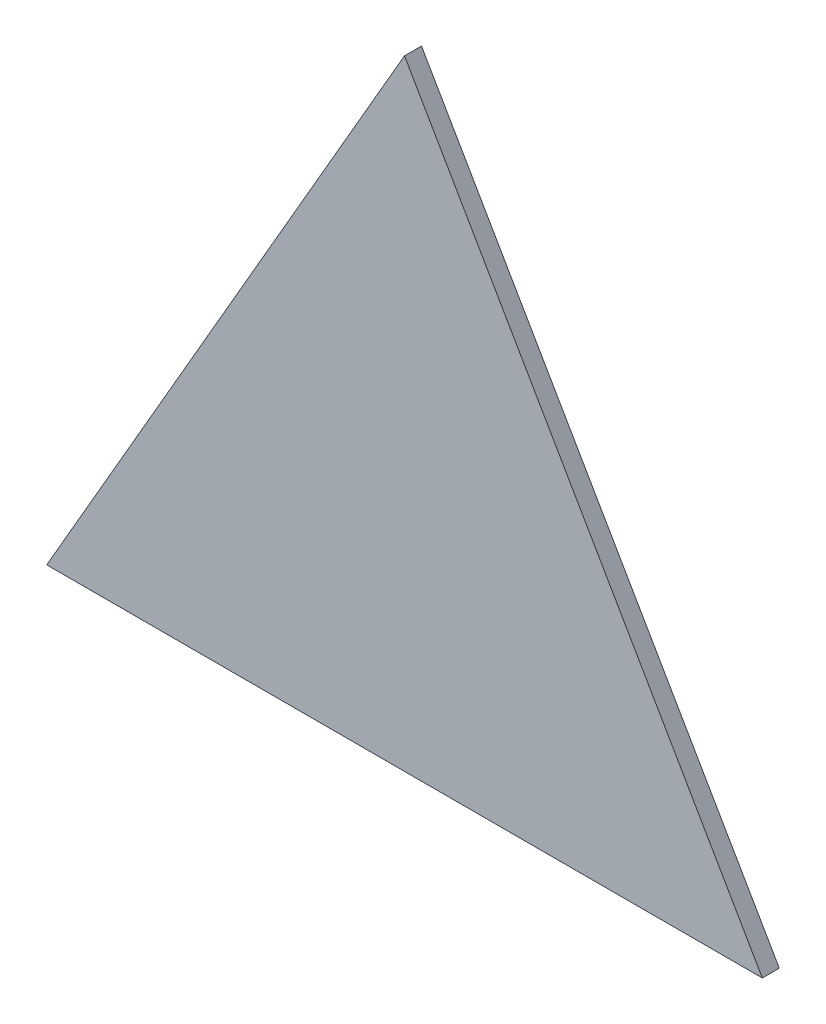
ISO-10303-21;
HEADER;
FILE_DESCRIPTION(('STEP AP214'),'2;1');
FILE_NAME('part.step','',(''),(''),'','','');
FILE_SCHEMA(('AUTOMOTIVE_DESIGN { 1 0 10303 214 1 1 1 1 }'));
ENDSEC;
DATA;
#1=APPLICATION_CONTEXT('core data for automotive mechanical design processes');
#2=APPLICATION_PROTOCOL_DEFINITION('international standard','automotive_design',2000,#1);
#3=PRODUCT_CONTEXT('',#1,'mechanical');
#4=PRODUCT('Part','Part','',(#3));
#5=PRODUCT_RELATED_PRODUCT_CATEGORY('part','',(#4));
#6=PRODUCT_DEFINITION_FORMATION('','',#4);
#7=PRODUCT_DEFINITION_CONTEXT('part definition',#1,'design');
#8=PRODUCT_DEFINITION('design','',#6,#7);
#9=PRODUCT_DEFINITION_SHAPE('','',#8);
#10=(LENGTH_UNIT() NAMED_UNIT(*) SI_UNIT(.MILLI.,.METRE.));
#11=(NAMED_UNIT(*) PLANE_ANGLE_UNIT() SI_UNIT($,.RADIAN.));
#12=(NAMED_UNIT(*) SI_UNIT($,.STERADIAN.) SOLID_ANGLE_UNIT());
#13=UNCERTAINTY_MEASURE_WITH_UNIT(LENGTH_MEASURE(1.E-05),#10,'distance_accuracy_value','');
#14=(GEOMETRIC_REPRESENTATION_CONTEXT(3) GLOBAL_UNCERTAINTY_ASSIGNED_CONTEXT((#13)) GLOBAL_UNIT_ASSIGNED_CONTEXT((#10,
#11,#12)) REPRESENTATION_CONTEXT('',''));
#15=CARTESIAN_POINT('',(0.,0.,0.));
#16=DIRECTION('',(0.,0.,1.));
#17=DIRECTION('',(1.,0.,0.));
#18=AXIS2_PLACEMENT_3D('',#15,#16,#17);
#19=CARTESIAN_POINT('',(42.1465696508427,-36.5,2.));
#20=DIRECTION('',(-0.866025403784439,-0.5,0.));
#21=DIRECTION('',(0.5,-0.866025403784439,0.));
#22=AXIS2_PLACEMENT_3D('',#19,#20,#21);
#23=PLANE('',#22);
#24=DIRECTION('',(-0.5,0.866025403784439,0.));
#25=VECTOR('',#24,1.);
#26=CARTESIAN_POINT('',(42.1465696508427,-36.5,0.));
#27=LINE('',#26,#25);
#28=CARTESIAN_POINT('',(42.1465696508427,-36.5,0.));
#29=VERTEX_POINT('',#28);
#30=CARTESIAN_POINT('',(0.,36.5,0.));
#31=VERTEX_POINT('',#30);
#32=EDGE_CURVE('E80',#29,#31,#27,.T.);
#33=ORIENTED_EDGE('',*,*,#32,.T.);
#34=DIRECTION('',(0.,0.,-1.));
#35=VECTOR('',#34,1.);
#36=CARTESIAN_POINT('',(0.,36.5,2.));
#37=LINE('',#36,#35);
#38=CARTESIAN_POINT('',(0.,36.5,2.));
#39=VERTEX_POINT('',#38);
#40=EDGE_CURVE('E11',#39,#31,#37,.T.);
#41=ORIENTED_EDGE('',*,*,#40,.F.);
#42=DIRECTION('',(-0.5,0.866025403784439,0.));
#43=VECTOR('',#42,1.);
#44=CARTESIAN_POINT('',(42.1465696508427,-36.5,2.));
#45=LINE('',#44,#43);
#46=CARTESIAN_POINT('',(42.1465696508427,-36.5,2.));
#47=VERTEX_POINT('',#46);
#48=EDGE_CURVE('E73',#47,#39,#45,.T.);
#49=ORIENTED_EDGE('',*,*,#48,.F.);
#50=DIRECTION('',(0.,0.,-1.));
#51=VECTOR('',#50,1.);
#52=CARTESIAN_POINT('',(42.1465696508427,-36.5,2.));
#53=LINE('',#52,#51);
#54=EDGE_CURVE('E81',#47,#29,#53,.T.);
#55=ORIENTED_EDGE('',*,*,#54,.T.);
#56=EDGE_LOOP('',(#33,#41,#49,#55));
#57=FACE_BOUND('',#56,.T.);
#58=ADVANCED_FACE('F33',(#57),#23,.F.);
#59=CARTESIAN_POINT('',(0.,36.5,2.));
#60=DIRECTION('',(0.866025403784439,-0.5,0.));
#61=DIRECTION('',(0.5,0.866025403784439,0.));
#62=AXIS2_PLACEMENT_3D('',#59,#60,#61);
#63=PLANE('',#62);
#64=DIRECTION('',(-0.5,-0.866025403784439,0.));
#65=VECTOR('',#64,1.);
#66=CARTESIAN_POINT('',(0.,36.5,0.));
#67=LINE('',#66,#65);
#68=CARTESIAN_POINT('',(-42.1465696508427,-36.5,0.));
#69=VERTEX_POINT('',#68);
#70=EDGE_CURVE('E61',#31,#69,#67,.T.);
#71=ORIENTED_EDGE('',*,*,#70,.T.);
#72=DIRECTION('',(0.,0.,-1.));
#73=VECTOR('',#72,1.);
#74=CARTESIAN_POINT('',(-42.1465696508427,-36.5,2.));
#75=LINE('',#74,#73);
#76=CARTESIAN_POINT('',(-42.1465696508427,-36.5,2.));
#77=VERTEX_POINT('',#76);
#78=EDGE_CURVE('E41',#77,#69,#75,.T.);
#79=ORIENTED_EDGE('',*,*,#78,.F.);
#80=DIRECTION('',(-0.5,-0.866025403784439,0.));
#81=VECTOR('',#80,1.);
#82=CARTESIAN_POINT('',(0.,36.5,2.));
#83=LINE('',#82,#81);
#84=EDGE_CURVE('E69',#39,#77,#83,.T.);
#85=ORIENTED_EDGE('',*,*,#84,.F.);
#86=ORIENTED_EDGE('',*,*,#40,.T.);
#87=EDGE_LOOP('',(#71,#79,#85,#86));
#88=FACE_BOUND('',#87,.T.);
#89=ADVANCED_FACE('F70',(#88),#63,.F.);
#90=CARTESIAN_POINT('',(-42.1465696508427,-36.5,2.));
#91=DIRECTION('',(0.,1.,0.));
#92=DIRECTION('',(0.,0.,1.));
#93=AXIS2_PLACEMENT_3D('',#90,#91,#92);
#94=PLANE('',#93);
#95=DIRECTION('',(1.,0.,0.));
#96=VECTOR('',#95,1.);
#97=CARTESIAN_POINT('',(-42.1465696508427,-36.5,0.));
#98=LINE('',#97,#96);
#99=EDGE_CURVE('E66',#69,#29,#98,.T.);
#100=ORIENTED_EDGE('',*,*,#99,.T.);
#101=ORIENTED_EDGE('',*,*,#54,.F.);
#102=DIRECTION('',(1.,0.,0.));
#103=VECTOR('',#102,1.);
#104=CARTESIAN_POINT('',(-42.1465696508427,-36.5,2.));
#105=LINE('',#104,#103);
#106=EDGE_CURVE('E49',#77,#47,#105,.T.);
#107=ORIENTED_EDGE('',*,*,#106,.F.);
#108=ORIENTED_EDGE('',*,*,#78,.T.);
#109=EDGE_LOOP('',(#100,#101,#107,#108));
#110=FACE_BOUND('',#109,.T.);
#111=ADVANCED_FACE('F88',(#110),#94,.F.);
#112=CARTESIAN_POINT('',(0.,0.,2.));
#113=DIRECTION('',(0.,0.,1.));
#114=DIRECTION('',(1.,0.,0.));
#115=AXIS2_PLACEMENT_3D('',#112,#113,#114);
#116=PLANE('',#115);
#117=ORIENTED_EDGE('',*,*,#48,.T.);
#118=ORIENTED_EDGE('',*,*,#84,.T.);
#119=ORIENTED_EDGE('',*,*,#106,.T.);
#120=EDGE_LOOP('',(#117,#118,#119));
#121=FACE_BOUND('',#120,.T.);
#122=ADVANCED_FACE('F76',(#121),#116,.T.);
#123=CARTESIAN_POINT('',(0.,0.,0.));
#124=DIRECTION('',(0.,0.,1.));
#125=DIRECTION('',(1.,0.,0.));
#126=AXIS2_PLACEMENT_3D('',#123,#124,#125);
#127=PLANE('',#126);
#128=ORIENTED_EDGE('',*,*,#32,.F.);
#129=ORIENTED_EDGE('',*,*,#99,.F.);
#130=ORIENTED_EDGE('',*,*,#70,.F.);
#131=EDGE_LOOP('',(#128,#129,#130));
#132=FACE_BOUND('',#131,.T.);
#133=ADVANCED_FACE('F89',(#132),#127,.F.);
#134=CLOSED_SHELL('',(#58,#89,#111,#122,#133));
#135=MANIFOLD_SOLID_BREP('B2',#134);
#136=ADVANCED_BREP_SHAPE_REPRESENTATION('',(#18,#135),#14);
#137=SHAPE_DEFINITION_REPRESENTATION(#9,#136);
ENDSEC;
END-ISO-10303-21;
